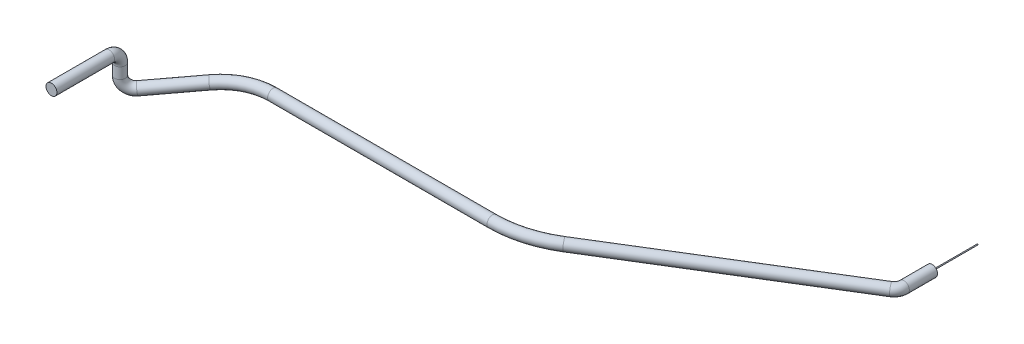
ISO-10303-21;
HEADER;
FILE_DESCRIPTION(('STEP AP214'),'2;1');
FILE_NAME('part.step','',(''),(''),'','','');
FILE_SCHEMA(('AUTOMOTIVE_DESIGN { 1 0 10303 214 1 1 1 1 }'));
ENDSEC;
DATA;
#1=APPLICATION_CONTEXT('core data for automotive mechanical design processes');
#2=APPLICATION_PROTOCOL_DEFINITION('international standard','automotive_design',2000,#1);
#3=PRODUCT_CONTEXT('',#1,'mechanical');
#4=PRODUCT('Part','Part','',(#3));
#5=PRODUCT_RELATED_PRODUCT_CATEGORY('part','',(#4));
#6=PRODUCT_DEFINITION_FORMATION('','',#4);
#7=PRODUCT_DEFINITION_CONTEXT('part definition',#1,'design');
#8=PRODUCT_DEFINITION('design','',#6,#7);
#9=PRODUCT_DEFINITION_SHAPE('','',#8);
#10=(LENGTH_UNIT() NAMED_UNIT(*) SI_UNIT(.MILLI.,.METRE.));
#11=(NAMED_UNIT(*) PLANE_ANGLE_UNIT() SI_UNIT($,.RADIAN.));
#12=(NAMED_UNIT(*) SI_UNIT($,.STERADIAN.) SOLID_ANGLE_UNIT());
#13=UNCERTAINTY_MEASURE_WITH_UNIT(LENGTH_MEASURE(1.E-05),#10,'distance_accuracy_value','');
#14=(GEOMETRIC_REPRESENTATION_CONTEXT(3) GLOBAL_UNCERTAINTY_ASSIGNED_CONTEXT((#13)) GLOBAL_UNIT_ASSIGNED_CONTEXT((#10,
#11,#12)) REPRESENTATION_CONTEXT('',''));
#15=CARTESIAN_POINT('',(0.,0.,0.));
#16=DIRECTION('',(0.,0.,1.));
#17=DIRECTION('',(1.,0.,0.));
#18=AXIS2_PLACEMENT_3D('',#15,#16,#17);
#19=CARTESIAN_POINT('',(60.65,-0.65,0.));
#20=DIRECTION('',(0.,0.,1.));
#21=DIRECTION('',(1.,0.,0.));
#22=AXIS2_PLACEMENT_3D('',#19,#20,#21);
#23=PLANE('',#22);
#24=CARTESIAN_POINT('',(60.65,-0.65,0.));
#25=DIRECTION('',(0.,0.,1.));
#26=DIRECTION('',(1.,0.,0.));
#27=AXIS2_PLACEMENT_3D('',#24,#25,#26);
#28=CIRCLE('',#27,1.5);
#29=CARTESIAN_POINT('',(62.15,-0.65,0.));
#30=VERTEX_POINT('',#29);
#31=EDGE_CURVE('E72',#30,#30,#28,.T.);
#32=ORIENTED_EDGE('',*,*,#31,.F.);
#33=EDGE_LOOP('',(#32));
#34=FACE_BOUND('',#33,.T.);
#35=CARTESIAN_POINT('',(60.65,-0.65,0.));
#36=DIRECTION('',(0.,0.,1.));
#37=DIRECTION('',(1.,0.,0.));
#38=AXIS2_PLACEMENT_3D('',#35,#36,#37);
#39=CIRCLE('',#38,0.125);
#40=CARTESIAN_POINT('',(60.775,-0.65,0.));
#41=VERTEX_POINT('',#40);
#42=EDGE_CURVE('E10',#41,#41,#39,.F.);
#43=ORIENTED_EDGE('',*,*,#42,.F.);
#44=EDGE_LOOP('',(#43));
#45=FACE_BOUND('',#44,.T.);
#46=ADVANCED_FACE('F30',(#34,#45),#23,.F.);
#47=CARTESIAN_POINT('',(-93.4787976387061,9.50000000000001,72.238791398855));
#48=DIRECTION('',(0.,0.,1.));
#49=DIRECTION('',(0.,-1.,0.));
#50=AXIS2_PLACEMENT_3D('',#47,#48,#49);
#51=CYLINDRICAL_SURFACE('',#50,1.5);
#52=CARTESIAN_POINT('',(-93.4787976387061,9.50000000000001,72.238791398855));
#53=DIRECTION('',(0.,0.,1.));
#54=DIRECTION('',(0.730961513111638,-0.682418688452731,0.));
#55=AXIS2_PLACEMENT_3D('',#52,#53,#54);
#56=CIRCLE('',#55,1.5);
#57=CARTESIAN_POINT('',(-93.4787976387061,11.,72.238791398855));
#58=VERTEX_POINT('',#57);
#59=EDGE_CURVE('E41',#58,#58,#56,.T.);
#60=ORIENTED_EDGE('',*,*,#59,.T.);
#61=EDGE_LOOP('',(#60));
#62=FACE_BOUND('',#61,.T.);
#63=CARTESIAN_POINT('',(-93.4787976387061,9.50000000000001,88.091291398855));
#64=DIRECTION('',(0.,0.,1.));
#65=DIRECTION('',(0.730961513111638,-0.682418688452731,0.));
#66=AXIS2_PLACEMENT_3D('',#63,#64,#65);
#67=CIRCLE('',#66,1.5);
#68=CARTESIAN_POINT('',(-92.3823553690387,8.47637196732091,88.091291398855));
#69=VERTEX_POINT('',#68);
#70=EDGE_CURVE('E37',#69,#69,#67,.T.);
#71=ORIENTED_EDGE('',*,*,#70,.F.);
#72=EDGE_LOOP('',(#71));
#73=FACE_BOUND('',#72,.T.);
#74=ADVANCED_FACE('F32',(#62,#73),#51,.T.);
#75=CARTESIAN_POINT('',(-93.4787976387061,6.50000000000001,72.238791398855));
#76=DIRECTION('',(1.,0.,0.));
#77=DIRECTION('',(0.,0.,-1.));
#78=AXIS2_PLACEMENT_3D('',#75,#76,#77);
#79=TOROIDAL_SURFACE('',#78,3.,1.5);
#80=CARTESIAN_POINT('',(-93.4787976387061,6.49999999999999,69.238791398855));
#81=DIRECTION('',(0.,1.,0.));
#82=DIRECTION('',(0.730961513111638,0.,0.682418688452731));
#83=AXIS2_PLACEMENT_3D('',#80,#81,#82);
#84=CIRCLE('',#83,1.5);
#85=CARTESIAN_POINT('',(-93.4787976387061,6.49999999999999,67.738791398855));
#86=VERTEX_POINT('',#85);
#87=EDGE_CURVE('E45',#86,#86,#84,.T.);
#88=CARTESIAN_POINT('',(-93.4787976387061,6.50000000000001,72.238791398855));
#89=DIRECTION('',(1.,0.,0.));
#90=DIRECTION('',(0.,0.,-1.));
#91=AXIS2_PLACEMENT_3D('',#88,#89,#90);
#92=CIRCLE('',#91,4.50000000000001);
#93=EDGE_CURVE('',#86,#58,#92,.T.);
#94=ORIENTED_EDGE('',*,*,#87,.T.);
#95=ORIENTED_EDGE('',*,*,#59,.F.);
#96=ORIENTED_EDGE('',*,*,#93,.T.);
#97=ORIENTED_EDGE('',*,*,#93,.F.);
#98=EDGE_LOOP('',(#94,#96,#95,#97));
#99=FACE_BOUND('',#98,.T.);
#100=ADVANCED_FACE('F100',(#99),#79,.T.);
#101=CARTESIAN_POINT('',(-93.4787976387061,3.48357524282471,69.238791398855));
#102=DIRECTION('',(0.,1.,0.));
#103=DIRECTION('',(0.,0.,1.));
#104=AXIS2_PLACEMENT_3D('',#101,#102,#103);
#105=CYLINDRICAL_SURFACE('',#104,1.5);
#106=CARTESIAN_POINT('',(-93.4787976387061,3.48357524282471,69.238791398855));
#107=DIRECTION('',(0.,1.,0.));
#108=DIRECTION('',(0.730961513111638,0.,0.682418688452731));
#109=AXIS2_PLACEMENT_3D('',#106,#107,#108);
#110=CIRCLE('',#109,1.5);
#111=CARTESIAN_POINT('',(-94.611495700501,3.4835752428247,70.2221504893231));
#112=VERTEX_POINT('',#111);
#113=EDGE_CURVE('E50',#112,#112,#110,.T.);
#114=ORIENTED_EDGE('',*,*,#113,.T.);
#115=EDGE_LOOP('',(#114));
#116=FACE_BOUND('',#115,.T.);
#117=ORIENTED_EDGE('',*,*,#87,.F.);
#118=EDGE_LOOP('',(#117));
#119=FACE_BOUND('',#118,.T.);
#120=ADVANCED_FACE('F135',(#116,#119),#105,.T.);
#121=CARTESIAN_POINT('',(-91.2134015151165,3.48357524282472,67.2720732179188));
#122=DIRECTION('',(-0.655572726978735,0.,-0.755132041196548));
#123=DIRECTION('',(-0.755132041196548,0.,0.655572726978735));
#124=AXIS2_PLACEMENT_3D('',#121,#122,#123);
#125=TOROIDAL_SURFACE('',#124,3.,1.5);
#126=CARTESIAN_POINT('',(-90.8773433725588,0.516767824122759,66.9803221850917));
#127=DIRECTION('',(-0.746777113973825,-0.148344097113206,0.64831934329973));
#128=DIRECTION('',(0.640259747254247,0.103440093234312,0.761162008482823));
#129=AXIS2_PLACEMENT_3D('',#126,#127,#128);
#130=CIRCLE('',#129,1.5);
#131=CARTESIAN_POINT('',(-90.70931430128,-0.966635885228226,66.8344466686781));
#132=VERTEX_POINT('',#131);
#133=EDGE_CURVE('E53',#132,#132,#130,.T.);
#134=CARTESIAN_POINT('',(-91.2134015151165,3.48357524282472,67.2720732179188));
#135=DIRECTION('',(-0.655572726978735,0.,-0.755132041196548));
#136=DIRECTION('',(-0.755132041196548,0.,0.655572726978735));
#137=AXIS2_PLACEMENT_3D('',#134,#135,#136);
#138=CIRCLE('',#137,4.5);
#139=EDGE_CURVE('',#132,#112,#138,.T.);
#140=ORIENTED_EDGE('',*,*,#133,.T.);
#141=ORIENTED_EDGE('',*,*,#113,.F.);
#142=ORIENTED_EDGE('',*,*,#139,.T.);
#143=ORIENTED_EDGE('',*,*,#139,.F.);
#144=EDGE_LOOP('',(#140,#142,#141,#143));
#145=FACE_BOUND('',#144,.T.);
#146=ADVANCED_FACE('F131',(#145),#125,.T.);
#147=CARTESIAN_POINT('',(-80.2116527929903,2.63546188893629,57.7208344704932));
#148=DIRECTION('',(-0.746777113973825,-0.148344097113206,0.648319343299729));
#149=DIRECTION('',(0.655572726978735,0.,0.755132041196548));
#150=AXIS2_PLACEMENT_3D('',#147,#148,#149);
#151=CYLINDRICAL_SURFACE('',#150,1.5);
#152=CARTESIAN_POINT('',(-80.2116527929903,2.63546188893629,57.7208344704932));
#153=DIRECTION('',(-0.746777113973825,-0.148344097113206,0.64831934329973));
#154=DIRECTION('',(0.640259747254247,0.103440093234312,0.761162008482823));
#155=AXIS2_PLACEMENT_3D('',#152,#153,#154);
#156=CIRCLE('',#155,1.5);
#157=CARTESIAN_POINT('',(-81.2092643755219,2.88531358670959,56.6288888401989));
#158=VERTEX_POINT('',#157);
#159=EDGE_CURVE('E56',#158,#158,#156,.T.);
#160=ORIENTED_EDGE('',*,*,#159,.T.);
#161=EDGE_LOOP('',(#160));
#162=FACE_BOUND('',#161,.T.);
#163=ORIENTED_EDGE('',*,*,#133,.F.);
#164=EDGE_LOOP('',(#163));
#165=FACE_BOUND('',#164,.T.);
#166=ADVANCED_FACE('F127',(#162,#165),#151,.T.);
#167=CARTESIAN_POINT('',(-67.5752394142575,-0.529326282858915,71.5521457875537));
#168=DIRECTION('',(0.,0.974807261641682,0.223048879509952));
#169=DIRECTION('',(0.,-0.223048879509952,0.974807261641682));
#170=AXIS2_PLACEMENT_3D('',#167,#168,#169);
#171=TOROIDAL_SURFACE('',#170,19.,1.5);
#172=CARTESIAN_POINT('',(-67.5752394142575,3.70860242783016,53.0308078163618));
#173=DIRECTION('',(-1.,0.,0.));
#174=DIRECTION('',(0.,0.0490663821497372,0.998795519684953));
#175=AXIS2_PLACEMENT_3D('',#172,#173,#174);
#176=CIRCLE('',#175,1.5);
#177=CARTESIAN_POINT('',(-67.5752394142575,4.04317574709509,51.5685969238992));
#178=VERTEX_POINT('',#177);
#179=EDGE_CURVE('E59',#178,#178,#176,.T.);
#180=CARTESIAN_POINT('',(-67.5752394142575,-0.529326282858915,71.5521457875537));
#181=DIRECTION('',(0.,0.974807261641682,0.223048879509952));
#182=DIRECTION('',(0.,-0.223048879509952,0.974807261641682));
#183=AXIS2_PLACEMENT_3D('',#180,#181,#182);
#184=CIRCLE('',#183,20.5);
#185=EDGE_CURVE('',#178,#158,#184,.T.);
#186=ORIENTED_EDGE('',*,*,#179,.T.);
#187=ORIENTED_EDGE('',*,*,#159,.F.);
#188=ORIENTED_EDGE('',*,*,#185,.T.);
#189=ORIENTED_EDGE('',*,*,#185,.F.);
#190=EDGE_LOOP('',(#186,#188,#187,#189));
#191=FACE_BOUND('',#190,.T.);
#192=ADVANCED_FACE('F123',(#191),#171,.T.);
#193=CARTESIAN_POINT('',(-7.23967123793771,3.70860242783016,53.0308078163618));
#194=DIRECTION('',(-1.,0.,0.));
#195=DIRECTION('',(0.,0.,1.));
#196=AXIS2_PLACEMENT_3D('',#193,#194,#195);
#197=CYLINDRICAL_SURFACE('',#196,1.5);
#198=CARTESIAN_POINT('',(-7.23967123793771,3.70860242783016,53.0308078163618));
#199=DIRECTION('',(-1.,0.,0.));
#200=DIRECTION('',(0.,0.0490663821497372,0.998795519684953));
#201=AXIS2_PLACEMENT_3D('',#198,#199,#200);
#202=CIRCLE('',#201,1.5);
#203=CARTESIAN_POINT('',(-7.23967123793771,3.85728384310339,54.5234209064666));
#204=VERTEX_POINT('',#203);
#205=EDGE_CURVE('E62',#204,#204,#202,.T.);
#206=ORIENTED_EDGE('',*,*,#205,.T.);
#207=EDGE_LOOP('',(#206));
#208=FACE_BOUND('',#207,.T.);
#209=ORIENTED_EDGE('',*,*,#179,.F.);
#210=EDGE_LOOP('',(#209));
#211=FACE_BOUND('',#210,.T.);
#212=ADVANCED_FACE('F119',(#208,#211),#197,.T.);
#213=CARTESIAN_POINT('',(-7.23967123793771,1.23057883994305,28.1539229812809));
#214=DIRECTION('',(0.,-0.995075393403234,0.0991209435154844));
#215=DIRECTION('',(0.,-0.0991209435154844,-0.995075393403234));
#216=AXIS2_PLACEMENT_3D('',#213,#214,#215);
#217=TOROIDAL_SURFACE('',#216,25.,1.5);
#218=CARTESIAN_POINT('',(7.59088152403722,3.22548406497882,48.1807813948565));
#219=DIRECTION('',(-0.805038836105964,0.0588007353049253,0.590300724960385));
#220=DIRECTION('',(0.592474858706369,0.029765990022567,0.805038836105964));
#221=AXIS2_PLACEMENT_3D('',#218,#219,#220);
#222=CIRCLE('',#221,1.5);
#223=CARTESIAN_POINT('',(8.48071468975571,3.34517837848096,49.382392899671));
#224=VERTEX_POINT('',#223);
#225=EDGE_CURVE('E65',#224,#224,#222,.T.);
#226=CARTESIAN_POINT('',(-7.23967123793771,1.23057883994305,28.1539229812809));
#227=DIRECTION('',(0.,-0.995075393403234,0.0991209435154844));
#228=DIRECTION('',(0.,-0.0991209435154844,-0.995075393403234));
#229=AXIS2_PLACEMENT_3D('',#226,#227,#228);
#230=CIRCLE('',#229,26.5);
#231=EDGE_CURVE('',#224,#204,#230,.T.);
#232=ORIENTED_EDGE('',*,*,#225,.T.);
#233=ORIENTED_EDGE('',*,*,#205,.F.);
#234=ORIENTED_EDGE('',*,*,#231,.T.);
#235=ORIENTED_EDGE('',*,*,#231,.F.);
#236=EDGE_LOOP('',(#232,#234,#233,#235));
#237=FACE_BOUND('',#236,.T.);
#238=ADVANCED_FACE('F115',(#237),#217,.T.);
#239=CARTESIAN_POINT('',(59.4241677135367,-0.56046414586256,10.1736380839301));
#240=DIRECTION('',(-0.805038836105963,0.0588007353049252,0.590300724960386));
#241=DIRECTION('',(0.591323869078677,0.,0.806434177014977));
#242=AXIS2_PLACEMENT_3D('',#239,#240,#241);
#243=CYLINDRICAL_SURFACE('',#242,1.5);
#244=CARTESIAN_POINT('',(59.4241677135367,-0.56046414586256,10.1736380839301));
#245=DIRECTION('',(-0.805038836105964,0.0588007353049253,0.590300724960385));
#246=DIRECTION('',(0.592474858706369,0.029765990022567,0.805038836105964));
#247=AXIS2_PLACEMENT_3D('',#244,#245,#246);
#248=CIRCLE('',#247,1.5);
#249=CARTESIAN_POINT('',(60.3072662829803,-0.624966431840693,11.3844131958936));
#250=VERTEX_POINT('',#249);
#251=EDGE_CURVE('E68',#250,#250,#248,.T.);
#252=ORIENTED_EDGE('',*,*,#251,.T.);
#253=EDGE_LOOP('',(#252));
#254=FACE_BOUND('',#253,.T.);
#255=ORIENTED_EDGE('',*,*,#225,.F.);
#256=EDGE_LOOP('',(#255));
#257=FACE_BOUND('',#256,.T.);
#258=ADVANCED_FACE('F111',(#254,#257),#243,.T.);
#259=CARTESIAN_POINT('',(57.6579705746496,-0.431459573906294,7.75208786000305));
#260=DIRECTION('',(-0.0728468086979018,-0.997343141783474,0.));
#261=DIRECTION('',(0.997343141783474,-0.0728468086979018,0.));
#262=AXIS2_PLACEMENT_3D('',#259,#260,#261);
#263=TOROIDAL_SURFACE('',#262,3.,1.5);
#264=CARTESIAN_POINT('',(60.65,-0.65,7.75208786000305));
#265=DIRECTION('',(0.,0.,1.));
#266=DIRECTION('',(1.,0.,0.));
#267=AXIS2_PLACEMENT_3D('',#264,#265,#266);
#268=CIRCLE('',#267,1.5);
#269=CARTESIAN_POINT('',(62.1460147126752,-0.759270213046853,7.75208786000305));
#270=VERTEX_POINT('',#269);
#271=EDGE_CURVE('E71',#270,#270,#268,.T.);
#272=CARTESIAN_POINT('',(57.6579705746496,-0.431459573906294,7.75208786000305));
#273=DIRECTION('',(-0.0728468086979018,-0.997343141783474,0.));
#274=DIRECTION('',(0.997343141783474,-0.0728468086979018,0.));
#275=AXIS2_PLACEMENT_3D('',#272,#273,#274);
#276=CIRCLE('',#275,4.5);
#277=EDGE_CURVE('',#270,#250,#276,.T.);
#278=ORIENTED_EDGE('',*,*,#271,.T.);
#279=ORIENTED_EDGE('',*,*,#251,.F.);
#280=ORIENTED_EDGE('',*,*,#277,.T.);
#281=ORIENTED_EDGE('',*,*,#277,.F.);
#282=EDGE_LOOP('',(#278,#280,#279,#281));
#283=FACE_BOUND('',#282,.T.);
#284=ADVANCED_FACE('F107',(#283),#263,.T.);
#285=CARTESIAN_POINT('',(60.65,-0.65,7.75208786000305));
#286=DIRECTION('',(0.,0.,-1.));
#287=DIRECTION('',(-1.,0.,0.));
#288=AXIS2_PLACEMENT_3D('',#285,#286,#287);
#289=CYLINDRICAL_SURFACE('',#288,1.5);
#290=ORIENTED_EDGE('',*,*,#271,.F.);
#291=EDGE_LOOP('',(#290));
#292=FACE_BOUND('',#291,.T.);
#293=ORIENTED_EDGE('',*,*,#31,.T.);
#294=EDGE_LOOP('',(#293));
#295=FACE_BOUND('',#294,.T.);
#296=ADVANCED_FACE('F92',(#292,#295),#289,.T.);
#297=CARTESIAN_POINT('',(-93.4787976387061,9.50000000000001,88.091291398855));
#298=DIRECTION('',(0.,0.,1.));
#299=DIRECTION('',(0.730961513111638,-0.682418688452731,0.));
#300=AXIS2_PLACEMENT_3D('',#297,#298,#299);
#301=PLANE('',#300);
#302=ORIENTED_EDGE('',*,*,#70,.T.);
#303=EDGE_LOOP('',(#302));
#304=FACE_BOUND('',#303,.T.);
#305=ADVANCED_FACE('F85',(#304),#301,.T.);
#306=CARTESIAN_POINT('',(60.65,-0.65,-12.5));
#307=DIRECTION('',(0.,0.,1.));
#308=DIRECTION('',(1.,0.,0.));
#309=AXIS2_PLACEMENT_3D('',#306,#307,#308);
#310=CYLINDRICAL_SURFACE('',#309,0.125);
#311=CARTESIAN_POINT('',(60.65,-0.65,-12.5));
#312=DIRECTION('',(0.,0.,-1.));
#313=DIRECTION('',(-1.,0.,0.));
#314=AXIS2_PLACEMENT_3D('',#311,#312,#313);
#315=CIRCLE('',#314,0.125);
#316=CARTESIAN_POINT('',(60.525,-0.65,-12.5));
#317=VERTEX_POINT('',#316);
#318=EDGE_CURVE('E75',#317,#317,#315,.T.);
#319=ORIENTED_EDGE('',*,*,#318,.F.);
#320=EDGE_LOOP('',(#319));
#321=FACE_BOUND('',#320,.T.);
#322=ORIENTED_EDGE('',*,*,#42,.T.);
#323=EDGE_LOOP('',(#322));
#324=FACE_BOUND('',#323,.T.);
#325=ADVANCED_FACE('F83',(#321,#324),#310,.T.);
#326=CARTESIAN_POINT('',(60.65,-0.65,-12.5));
#327=DIRECTION('',(0.,0.,-1.));
#328=DIRECTION('',(-1.,0.,0.));
#329=AXIS2_PLACEMENT_3D('',#326,#327,#328);
#330=PLANE('',#329);
#331=ORIENTED_EDGE('',*,*,#318,.T.);
#332=EDGE_LOOP('',(#331));
#333=FACE_BOUND('',#332,.T.);
#334=ADVANCED_FACE('F81',(#333),#330,.T.);
#335=CLOSED_SHELL('',(#46,#74,#100,#120,#146,#166,#192,#212,#238,#258,#284,#296,#305,#325,#334));
#336=MANIFOLD_SOLID_BREP('B2',#335);
#337=ADVANCED_BREP_SHAPE_REPRESENTATION('',(#18,#336),#14);
#338=SHAPE_DEFINITION_REPRESENTATION(#9,#337);
ENDSEC;
END-ISO-10303-21;
